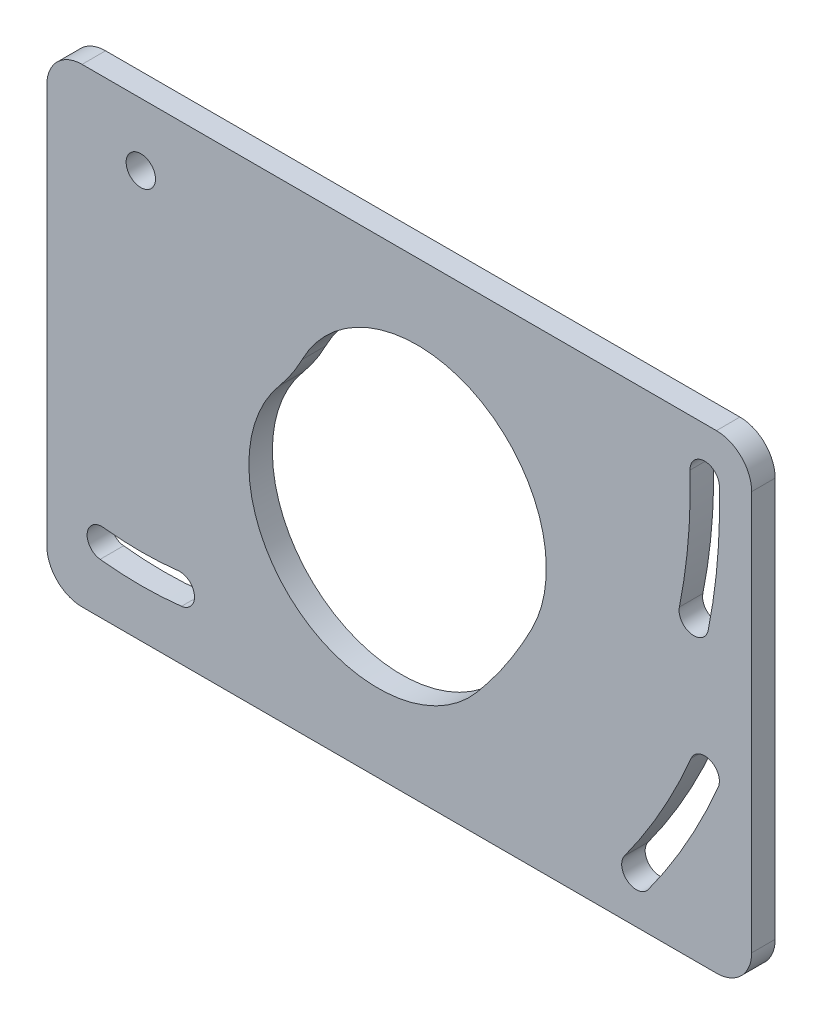
ISO-10303-21;
HEADER;
FILE_DESCRIPTION(('STEP AP214'),'2;1');
FILE_NAME('part.step','',(''),(''),'','','');
FILE_SCHEMA(('AUTOMOTIVE_DESIGN { 1 0 10303 214 1 1 1 1 }'));
ENDSEC;
DATA;
#1=APPLICATION_CONTEXT('core data for automotive mechanical design processes');
#2=APPLICATION_PROTOCOL_DEFINITION('international standard','automotive_design',2000,#1);
#3=PRODUCT_CONTEXT('',#1,'mechanical');
#4=PRODUCT('Part','Part','',(#3));
#5=PRODUCT_RELATED_PRODUCT_CATEGORY('part','',(#4));
#6=PRODUCT_DEFINITION_FORMATION('','',#4);
#7=PRODUCT_DEFINITION_CONTEXT('part definition',#1,'design');
#8=PRODUCT_DEFINITION('design','',#6,#7);
#9=PRODUCT_DEFINITION_SHAPE('','',#8);
#10=(LENGTH_UNIT() NAMED_UNIT(*) SI_UNIT(.MILLI.,.METRE.));
#11=(NAMED_UNIT(*) PLANE_ANGLE_UNIT() SI_UNIT($,.RADIAN.));
#12=(NAMED_UNIT(*) SI_UNIT($,.STERADIAN.) SOLID_ANGLE_UNIT());
#13=UNCERTAINTY_MEASURE_WITH_UNIT(LENGTH_MEASURE(1.E-05),#10,'distance_accuracy_value','');
#14=(GEOMETRIC_REPRESENTATION_CONTEXT(3) GLOBAL_UNCERTAINTY_ASSIGNED_CONTEXT((#13)) GLOBAL_UNIT_ASSIGNED_CONTEXT((#10,
#11,#12)) REPRESENTATION_CONTEXT('',''));
#15=CARTESIAN_POINT('',(0.,0.,0.));
#16=DIRECTION('',(0.,0.,1.));
#17=DIRECTION('',(1.,0.,0.));
#18=AXIS2_PLACEMENT_3D('',#15,#16,#17);
#19=CARTESIAN_POINT('',(-27.,17.,2.));
#20=DIRECTION('',(0.,0.,-1.));
#21=DIRECTION('',(-1.,0.,0.));
#22=AXIS2_PLACEMENT_3D('',#19,#20,#21);
#23=CYLINDRICAL_SURFACE('',#22,3.);
#24=CARTESIAN_POINT('',(-27.,17.,0.));
#25=DIRECTION('',(0.,0.,1.));
#26=DIRECTION('',(1.,0.,0.));
#27=AXIS2_PLACEMENT_3D('',#24,#25,#26);
#28=CIRCLE('',#27,3.);
#29=CARTESIAN_POINT('',(-30.,17.,0.));
#30=VERTEX_POINT('',#29);
#31=CARTESIAN_POINT('',(-27.,20.,0.));
#32=VERTEX_POINT('',#31);
#33=EDGE_CURVE('E284',#30,#32,#28,.F.);
#34=ORIENTED_EDGE('',*,*,#33,.F.);
#35=DIRECTION('',(0.,0.,-1.));
#36=VECTOR('',#35,1.);
#37=CARTESIAN_POINT('',(-30.,17.,2.));
#38=LINE('',#37,#36);
#39=CARTESIAN_POINT('',(-30.,17.,2.));
#40=VERTEX_POINT('',#39);
#41=EDGE_CURVE('E11',#40,#30,#38,.T.);
#42=ORIENTED_EDGE('',*,*,#41,.F.);
#43=CARTESIAN_POINT('',(-27.,17.,2.));
#44=DIRECTION('',(0.,0.,1.));
#45=DIRECTION('',(1.,0.,0.));
#46=AXIS2_PLACEMENT_3D('',#43,#44,#45);
#47=CIRCLE('',#46,3.);
#48=CARTESIAN_POINT('',(-27.,20.,2.));
#49=VERTEX_POINT('',#48);
#50=EDGE_CURVE('E402',#40,#49,#47,.F.);
#51=ORIENTED_EDGE('',*,*,#50,.T.);
#52=DIRECTION('',(0.,0.,-1.));
#53=VECTOR('',#52,1.);
#54=CARTESIAN_POINT('',(-27.,20.,2.));
#55=LINE('',#54,#53);
#56=EDGE_CURVE('E54',#49,#32,#55,.T.);
#57=ORIENTED_EDGE('',*,*,#56,.T.);
#58=EDGE_LOOP('',(#34,#42,#51,#57));
#59=FACE_BOUND('',#58,.T.);
#60=ADVANCED_FACE('F35',(#59),#23,.T.);
#61=CARTESIAN_POINT('',(-30.,0.,2.));
#62=DIRECTION('',(-1.,0.,0.));
#63=DIRECTION('',(0.,0.,1.));
#64=AXIS2_PLACEMENT_3D('',#61,#62,#63);
#65=PLANE('',#64);
#66=DIRECTION('',(0.,1.,0.));
#67=VECTOR('',#66,1.);
#68=CARTESIAN_POINT('',(-30.,0.,0.));
#69=LINE('',#68,#67);
#70=CARTESIAN_POINT('',(-30.,-17.,0.));
#71=VERTEX_POINT('',#70);
#72=EDGE_CURVE('E286',#71,#30,#69,.T.);
#73=ORIENTED_EDGE('',*,*,#72,.F.);
#74=DIRECTION('',(0.,0.,-1.));
#75=VECTOR('',#74,1.);
#76=CARTESIAN_POINT('',(-30.,-17.,2.));
#77=LINE('',#76,#75);
#78=CARTESIAN_POINT('',(-30.,-17.,2.));
#79=VERTEX_POINT('',#78);
#80=EDGE_CURVE('E45',#79,#71,#77,.T.);
#81=ORIENTED_EDGE('',*,*,#80,.F.);
#82=DIRECTION('',(0.,1.,0.));
#83=VECTOR('',#82,1.);
#84=CARTESIAN_POINT('',(-30.,0.,2.));
#85=LINE('',#84,#83);
#86=EDGE_CURVE('E404',#79,#40,#85,.T.);
#87=ORIENTED_EDGE('',*,*,#86,.T.);
#88=ORIENTED_EDGE('',*,*,#41,.T.);
#89=EDGE_LOOP('',(#73,#81,#87,#88));
#90=FACE_BOUND('',#89,.T.);
#91=ADVANCED_FACE('F435',(#90),#65,.T.);
#92=CARTESIAN_POINT('',(-27.,-17.,2.));
#93=DIRECTION('',(0.,0.,-1.));
#94=DIRECTION('',(-1.,0.,0.));
#95=AXIS2_PLACEMENT_3D('',#92,#93,#94);
#96=CYLINDRICAL_SURFACE('',#95,3.);
#97=CARTESIAN_POINT('',(-27.,-17.,0.));
#98=DIRECTION('',(0.,0.,1.));
#99=DIRECTION('',(1.,0.,0.));
#100=AXIS2_PLACEMENT_3D('',#97,#98,#99);
#101=CIRCLE('',#100,3.);
#102=CARTESIAN_POINT('',(-27.,-20.,0.));
#103=VERTEX_POINT('',#102);
#104=EDGE_CURVE('E289',#103,#71,#101,.F.);
#105=ORIENTED_EDGE('',*,*,#104,.F.);
#106=DIRECTION('',(0.,0.,-1.));
#107=VECTOR('',#106,1.);
#108=CARTESIAN_POINT('',(-27.,-20.,2.));
#109=LINE('',#108,#107);
#110=CARTESIAN_POINT('',(-27.,-20.,2.));
#111=VERTEX_POINT('',#110);
#112=EDGE_CURVE('E311',#111,#103,#109,.T.);
#113=ORIENTED_EDGE('',*,*,#112,.F.);
#114=CARTESIAN_POINT('',(-27.,-17.,2.));
#115=DIRECTION('',(0.,0.,1.));
#116=DIRECTION('',(1.,0.,0.));
#117=AXIS2_PLACEMENT_3D('',#114,#115,#116);
#118=CIRCLE('',#117,3.);
#119=EDGE_CURVE('E407',#111,#79,#118,.F.);
#120=ORIENTED_EDGE('',*,*,#119,.T.);
#121=ORIENTED_EDGE('',*,*,#80,.T.);
#122=EDGE_LOOP('',(#105,#113,#120,#121));
#123=FACE_BOUND('',#122,.T.);
#124=ADVANCED_FACE('F440',(#123),#96,.T.);
#125=CARTESIAN_POINT('',(0.,-20.,2.));
#126=DIRECTION('',(0.,1.,0.));
#127=DIRECTION('',(0.,0.,1.));
#128=AXIS2_PLACEMENT_3D('',#125,#126,#127);
#129=PLANE('',#128);
#130=DIRECTION('',(1.,0.,0.));
#131=VECTOR('',#130,1.);
#132=CARTESIAN_POINT('',(0.,-20.,0.));
#133=LINE('',#132,#131);
#134=CARTESIAN_POINT('',(27.,-20.,0.));
#135=VERTEX_POINT('',#134);
#136=EDGE_CURVE('E292',#103,#135,#133,.T.);
#137=ORIENTED_EDGE('',*,*,#136,.T.);
#138=DIRECTION('',(0.,0.,-1.));
#139=VECTOR('',#138,1.);
#140=CARTESIAN_POINT('',(27.,-20.,2.));
#141=LINE('',#140,#139);
#142=CARTESIAN_POINT('',(27.,-20.,2.));
#143=VERTEX_POINT('',#142);
#144=EDGE_CURVE('E308',#143,#135,#141,.T.);
#145=ORIENTED_EDGE('',*,*,#144,.F.);
#146=DIRECTION('',(1.,0.,0.));
#147=VECTOR('',#146,1.);
#148=CARTESIAN_POINT('',(0.,-20.,2.));
#149=LINE('',#148,#147);
#150=EDGE_CURVE('E410',#111,#143,#149,.T.);
#151=ORIENTED_EDGE('',*,*,#150,.F.);
#152=ORIENTED_EDGE('',*,*,#112,.T.);
#153=EDGE_LOOP('',(#137,#145,#151,#152));
#154=FACE_BOUND('',#153,.T.);
#155=ADVANCED_FACE('F416',(#154),#129,.F.);
#156=CARTESIAN_POINT('',(27.,-17.,2.));
#157=DIRECTION('',(0.,0.,-1.));
#158=DIRECTION('',(-1.,0.,0.));
#159=AXIS2_PLACEMENT_3D('',#156,#157,#158);
#160=CYLINDRICAL_SURFACE('',#159,3.);
#161=CARTESIAN_POINT('',(27.,-17.,0.));
#162=DIRECTION('',(0.,0.,1.));
#163=DIRECTION('',(1.,0.,0.));
#164=AXIS2_PLACEMENT_3D('',#161,#162,#163);
#165=CIRCLE('',#164,3.);
#166=CARTESIAN_POINT('',(30.,-17.,0.));
#167=VERTEX_POINT('',#166);
#168=EDGE_CURVE('E295',#135,#167,#165,.T.);
#169=ORIENTED_EDGE('',*,*,#168,.T.);
#170=DIRECTION('',(0.,0.,-1.));
#171=VECTOR('',#170,1.);
#172=CARTESIAN_POINT('',(30.,-17.,2.));
#173=LINE('',#172,#171);
#174=CARTESIAN_POINT('',(30.,-17.,2.));
#175=VERTEX_POINT('',#174);
#176=EDGE_CURVE('E224',#175,#167,#173,.T.);
#177=ORIENTED_EDGE('',*,*,#176,.F.);
#178=CARTESIAN_POINT('',(27.,-17.,2.));
#179=DIRECTION('',(0.,0.,1.));
#180=DIRECTION('',(1.,0.,0.));
#181=AXIS2_PLACEMENT_3D('',#178,#179,#180);
#182=CIRCLE('',#181,3.);
#183=EDGE_CURVE('E213',#143,#175,#182,.T.);
#184=ORIENTED_EDGE('',*,*,#183,.F.);
#185=ORIENTED_EDGE('',*,*,#144,.T.);
#186=EDGE_LOOP('',(#169,#177,#184,#185));
#187=FACE_BOUND('',#186,.T.);
#188=ADVANCED_FACE('F419',(#187),#160,.T.);
#189=CARTESIAN_POINT('',(30.,0.,2.));
#190=DIRECTION('',(-1.,0.,0.));
#191=DIRECTION('',(0.,0.,1.));
#192=AXIS2_PLACEMENT_3D('',#189,#190,#191);
#193=PLANE('',#192);
#194=DIRECTION('',(0.,1.,0.));
#195=VECTOR('',#194,1.);
#196=CARTESIAN_POINT('',(30.,0.,0.));
#197=LINE('',#196,#195);
#198=CARTESIAN_POINT('',(30.,17.,0.));
#199=VERTEX_POINT('',#198);
#200=EDGE_CURVE('E221',#167,#199,#197,.T.);
#201=ORIENTED_EDGE('',*,*,#200,.T.);
#202=DIRECTION('',(0.,0.,-1.));
#203=VECTOR('',#202,1.);
#204=CARTESIAN_POINT('',(30.,17.,2.));
#205=LINE('',#204,#203);
#206=CARTESIAN_POINT('',(30.,17.,2.));
#207=VERTEX_POINT('',#206);
#208=EDGE_CURVE('E219',#207,#199,#205,.T.);
#209=ORIENTED_EDGE('',*,*,#208,.F.);
#210=DIRECTION('',(0.,1.,0.));
#211=VECTOR('',#210,1.);
#212=CARTESIAN_POINT('',(30.,0.,2.));
#213=LINE('',#212,#211);
#214=EDGE_CURVE('E205',#175,#207,#213,.T.);
#215=ORIENTED_EDGE('',*,*,#214,.F.);
#216=ORIENTED_EDGE('',*,*,#176,.T.);
#217=EDGE_LOOP('',(#201,#209,#215,#216));
#218=FACE_BOUND('',#217,.T.);
#219=ADVANCED_FACE('F220',(#218),#193,.F.);
#220=CARTESIAN_POINT('',(27.,17.,2.));
#221=DIRECTION('',(0.,0.,-1.));
#222=DIRECTION('',(-1.,0.,0.));
#223=AXIS2_PLACEMENT_3D('',#220,#221,#222);
#224=CYLINDRICAL_SURFACE('',#223,3.);
#225=CARTESIAN_POINT('',(27.,17.,0.));
#226=DIRECTION('',(0.,0.,1.));
#227=DIRECTION('',(1.,0.,0.));
#228=AXIS2_PLACEMENT_3D('',#225,#226,#227);
#229=CIRCLE('',#228,3.);
#230=CARTESIAN_POINT('',(27.,20.,0.));
#231=VERTEX_POINT('',#230);
#232=EDGE_CURVE('E299',#231,#199,#229,.F.);
#233=ORIENTED_EDGE('',*,*,#232,.F.);
#234=DIRECTION('',(0.,0.,-1.));
#235=VECTOR('',#234,1.);
#236=CARTESIAN_POINT('',(27.,20.,2.));
#237=LINE('',#236,#235);
#238=CARTESIAN_POINT('',(27.,20.,2.));
#239=VERTEX_POINT('',#238);
#240=EDGE_CURVE('E127',#239,#231,#237,.T.);
#241=ORIENTED_EDGE('',*,*,#240,.F.);
#242=CARTESIAN_POINT('',(27.,17.,2.));
#243=DIRECTION('',(0.,0.,1.));
#244=DIRECTION('',(1.,0.,0.));
#245=AXIS2_PLACEMENT_3D('',#242,#243,#244);
#246=CIRCLE('',#245,3.);
#247=EDGE_CURVE('E211',#239,#207,#246,.F.);
#248=ORIENTED_EDGE('',*,*,#247,.T.);
#249=ORIENTED_EDGE('',*,*,#208,.T.);
#250=EDGE_LOOP('',(#233,#241,#248,#249));
#251=FACE_BOUND('',#250,.T.);
#252=ADVANCED_FACE('F226',(#251),#224,.T.);
#253=CARTESIAN_POINT('',(-18.6793723961413,-14.4781077665131,2.));
#254=DIRECTION('',(0.,0.,-1.));
#255=DIRECTION('',(-1.,0.,0.));
#256=AXIS2_PLACEMENT_3D('',#253,#254,#255);
#257=CYLINDRICAL_SURFACE('',#256,1.25);
#258=CARTESIAN_POINT('',(-18.6793723961413,-14.4781077665131,0.));
#259=DIRECTION('',(0.,0.,1.));
#260=DIRECTION('',(1.,0.,0.));
#261=AXIS2_PLACEMENT_3D('',#258,#259,#260);
#262=CIRCLE('',#261,1.25);
#263=CARTESIAN_POINT('',(-18.5378683789314,-15.7200725861088,0.));
#264=VERTEX_POINT('',#263);
#265=CARTESIAN_POINT('',(-18.8208764133512,-13.2361429469173,0.));
#266=VERTEX_POINT('',#265);
#267=EDGE_CURVE('E269',#264,#266,#262,.T.);
#268=ORIENTED_EDGE('',*,*,#267,.F.);
#269=DIRECTION('',(0.,0.,-1.));
#270=VECTOR('',#269,1.);
#271=CARTESIAN_POINT('',(-18.5378683789314,-15.7200725861088,2.));
#272=LINE('',#271,#270);
#273=CARTESIAN_POINT('',(-18.5378683789314,-15.7200725861088,2.));
#274=VERTEX_POINT('',#273);
#275=EDGE_CURVE('E305',#274,#264,#272,.T.);
#276=ORIENTED_EDGE('',*,*,#275,.F.);
#277=CARTESIAN_POINT('',(-18.6793723961413,-14.4781077665131,2.));
#278=DIRECTION('',(0.,0.,1.));
#279=DIRECTION('',(1.,0.,0.));
#280=AXIS2_PLACEMENT_3D('',#277,#278,#279);
#281=CIRCLE('',#280,1.25);
#282=CARTESIAN_POINT('',(-18.8208764133512,-13.2361429469173,2.));
#283=VERTEX_POINT('',#282);
#284=EDGE_CURVE('E388',#274,#283,#281,.T.);
#285=ORIENTED_EDGE('',*,*,#284,.T.);
#286=DIRECTION('',(0.,0.,-1.));
#287=VECTOR('',#286,1.);
#288=CARTESIAN_POINT('',(-18.8208764133512,-13.2361429469173,2.));
#289=LINE('',#288,#287);
#290=EDGE_CURVE('E314',#283,#266,#289,.T.);
#291=ORIENTED_EDGE('',*,*,#290,.T.);
#292=EDGE_LOOP('',(#268,#276,#285,#291));
#293=FACE_BOUND('',#292,.T.);
#294=ADVANCED_FACE('F462',(#293),#257,.F.);
#295=CARTESIAN_POINT('',(-22.,14.6666666666667,2.));
#296=DIRECTION('',(0.,0.,-1.));
#297=DIRECTION('',(-1.,0.,0.));
#298=AXIS2_PLACEMENT_3D('',#295,#296,#297);
#299=CYLINDRICAL_SURFACE('',#298,30.5833333333332);
#300=CARTESIAN_POINT('',(-22.,14.6666666666667,0.));
#301=DIRECTION('',(0.,0.,1.));
#302=DIRECTION('',(1.,0.,0.));
#303=AXIS2_PLACEMENT_3D('',#300,#301,#302);
#304=CIRCLE('',#303,30.5833333333332);
#305=CARTESIAN_POINT('',(-25.4621316210681,-15.7200725861089,0.));
#306=VERTEX_POINT('',#305);
#307=EDGE_CURVE('E272',#306,#264,#304,.T.);
#308=ORIENTED_EDGE('',*,*,#307,.F.);
#309=DIRECTION('',(0.,0.,-1.));
#310=VECTOR('',#309,1.);
#311=CARTESIAN_POINT('',(-25.4621316210681,-15.7200725861089,2.));
#312=LINE('',#311,#310);
#313=CARTESIAN_POINT('',(-25.4621316210681,-15.7200725861089,2.));
#314=VERTEX_POINT('',#313);
#315=EDGE_CURVE('E319',#314,#306,#312,.T.);
#316=ORIENTED_EDGE('',*,*,#315,.F.);
#317=CARTESIAN_POINT('',(-22.,14.6666666666667,2.));
#318=DIRECTION('',(0.,0.,1.));
#319=DIRECTION('',(1.,0.,0.));
#320=AXIS2_PLACEMENT_3D('',#317,#318,#319);
#321=CIRCLE('',#320,30.5833333333332);
#322=EDGE_CURVE('E391',#314,#274,#321,.T.);
#323=ORIENTED_EDGE('',*,*,#322,.T.);
#324=ORIENTED_EDGE('',*,*,#275,.T.);
#325=EDGE_LOOP('',(#308,#316,#323,#324));
#326=FACE_BOUND('',#325,.T.);
#327=ADVANCED_FACE('F458',(#326),#299,.F.);
#328=CARTESIAN_POINT('',(-25.3206276038583,-14.4781077665131,2.));
#329=DIRECTION('',(0.,0.,-1.));
#330=DIRECTION('',(-1.,0.,0.));
#331=AXIS2_PLACEMENT_3D('',#328,#329,#330);
#332=CYLINDRICAL_SURFACE('',#331,1.25);
#333=CARTESIAN_POINT('',(-25.3206276038583,-14.4781077665131,0.));
#334=DIRECTION('',(0.,0.,1.));
#335=DIRECTION('',(1.,0.,0.));
#336=AXIS2_PLACEMENT_3D('',#333,#334,#335);
#337=CIRCLE('',#336,1.25);
#338=CARTESIAN_POINT('',(-25.1791235866484,-13.2361429469174,0.));
#339=VERTEX_POINT('',#338);
#340=EDGE_CURVE('E275',#339,#306,#337,.T.);
#341=ORIENTED_EDGE('',*,*,#340,.F.);
#342=DIRECTION('',(0.,0.,-1.));
#343=VECTOR('',#342,1.);
#344=CARTESIAN_POINT('',(-25.1791235866484,-13.2361429469174,2.));
#345=LINE('',#344,#343);
#346=CARTESIAN_POINT('',(-25.1791235866484,-13.2361429469174,2.));
#347=VERTEX_POINT('',#346);
#348=EDGE_CURVE('E316',#347,#339,#345,.T.);
#349=ORIENTED_EDGE('',*,*,#348,.F.);
#350=CARTESIAN_POINT('',(-25.3206276038583,-14.4781077665131,2.));
#351=DIRECTION('',(0.,0.,1.));
#352=DIRECTION('',(1.,0.,0.));
#353=AXIS2_PLACEMENT_3D('',#350,#351,#352);
#354=CIRCLE('',#353,1.25);
#355=EDGE_CURVE('E394',#347,#314,#354,.T.);
#356=ORIENTED_EDGE('',*,*,#355,.T.);
#357=ORIENTED_EDGE('',*,*,#315,.T.);
#358=EDGE_LOOP('',(#341,#349,#356,#357));
#359=FACE_BOUND('',#358,.T.);
#360=ADVANCED_FACE('F454',(#359),#332,.F.);
#361=CARTESIAN_POINT('',(26.,-5.72498613163695,2.));
#362=DIRECTION('',(0.,0.,-1.));
#363=DIRECTION('',(-1.,0.,0.));
#364=AXIS2_PLACEMENT_3D('',#361,#362,#363);
#365=CYLINDRICAL_SURFACE('',#364,1.25);
#366=CARTESIAN_POINT('',(26.,-5.72498613163695,0.));
#367=DIRECTION('',(0.,0.,1.));
#368=DIRECTION('',(1.,0.,0.));
#369=AXIS2_PLACEMENT_3D('',#366,#367,#368);
#370=CIRCLE('',#369,1.25);
#371=CARTESIAN_POINT('',(27.1504856563741,-6.21374246609965,0.));
#372=VERTEX_POINT('',#371);
#373=CARTESIAN_POINT('',(24.8495143436259,-5.23622979717426,0.));
#374=VERTEX_POINT('',#373);
#375=EDGE_CURVE('E257',#372,#374,#370,.T.);
#376=ORIENTED_EDGE('',*,*,#375,.F.);
#377=DIRECTION('',(0.,0.,-1.));
#378=VECTOR('',#377,1.);
#379=CARTESIAN_POINT('',(27.1504856563741,-6.21374246609965,2.));
#380=LINE('',#379,#378);
#381=CARTESIAN_POINT('',(27.1504856563741,-6.21374246609965,2.));
#382=VERTEX_POINT('',#381);
#383=EDGE_CURVE('E317',#382,#372,#380,.T.);
#384=ORIENTED_EDGE('',*,*,#383,.F.);
#385=CARTESIAN_POINT('',(26.,-5.72498613163695,2.));
#386=DIRECTION('',(0.,0.,1.));
#387=DIRECTION('',(1.,0.,0.));
#388=AXIS2_PLACEMENT_3D('',#385,#386,#387);
#389=CIRCLE('',#388,1.25);
#390=CARTESIAN_POINT('',(24.8495143436259,-5.23622979717426,2.));
#391=VERTEX_POINT('',#390);
#392=EDGE_CURVE('E377',#382,#391,#389,.T.);
#393=ORIENTED_EDGE('',*,*,#392,.T.);
#394=DIRECTION('',(0.,0.,-1.));
#395=VECTOR('',#394,1.);
#396=CARTESIAN_POINT('',(24.8495143436259,-5.23622979717426,2.));
#397=LINE('',#396,#395);
#398=EDGE_CURVE('E322',#391,#374,#397,.T.);
#399=ORIENTED_EDGE('',*,*,#398,.T.);
#400=EDGE_LOOP('',(#376,#384,#393,#399));
#401=FACE_BOUND('',#400,.T.);
#402=ADVANCED_FACE('F457',(#401),#365,.F.);
#403=CARTESIAN_POINT('',(-22.,14.6666666666667,2.));
#404=DIRECTION('',(0.,0.,-1.));
#405=DIRECTION('',(-1.,0.,0.));
#406=AXIS2_PLACEMENT_3D('',#403,#404,#405);
#407=CYLINDRICAL_SURFACE('',#406,53.4018887850341);
#408=CARTESIAN_POINT('',(-22.,14.6666666666667,0.));
#409=DIRECTION('',(0.,0.,1.));
#410=DIRECTION('',(1.,0.,0.));
#411=AXIS2_PLACEMENT_3D('',#408,#409,#410);
#412=CIRCLE('',#411,53.4018887850341);
#413=CARTESIAN_POINT('',(21.1936918436799,-16.7350325026835,0.));
#414=VERTEX_POINT('',#413);
#415=EDGE_CURVE('E260',#414,#372,#412,.T.);
#416=ORIENTED_EDGE('',*,*,#415,.F.);
#417=DIRECTION('',(0.,0.,-1.));
#418=VECTOR('',#417,1.);
#419=CARTESIAN_POINT('',(21.1936918436799,-16.7350325026835,2.));
#420=LINE('',#419,#418);
#421=CARTESIAN_POINT('',(21.1936918436799,-16.7350325026835,2.));
#422=VERTEX_POINT('',#421);
#423=EDGE_CURVE('E327',#422,#414,#420,.T.);
#424=ORIENTED_EDGE('',*,*,#423,.F.);
#425=CARTESIAN_POINT('',(-22.,14.6666666666667,2.));
#426=DIRECTION('',(0.,0.,1.));
#427=DIRECTION('',(1.,0.,0.));
#428=AXIS2_PLACEMENT_3D('',#425,#426,#427);
#429=CIRCLE('',#428,53.4018887850341);
#430=EDGE_CURVE('E380',#422,#382,#429,.T.);
#431=ORIENTED_EDGE('',*,*,#430,.T.);
#432=ORIENTED_EDGE('',*,*,#383,.T.);
#433=EDGE_LOOP('',(#416,#424,#431,#432));
#434=FACE_BOUND('',#433,.T.);
#435=ADVANCED_FACE('F474',(#434),#407,.F.);
#436=CARTESIAN_POINT('',(20.1826393128988,-16.,2.));
#437=DIRECTION('',(0.,0.,-1.));
#438=DIRECTION('',(-1.,0.,0.));
#439=AXIS2_PLACEMENT_3D('',#436,#437,#438);
#440=CYLINDRICAL_SURFACE('',#439,1.25);
#441=CARTESIAN_POINT('',(20.1826393128988,-16.,0.));
#442=DIRECTION('',(0.,0.,1.));
#443=DIRECTION('',(1.,0.,0.));
#444=AXIS2_PLACEMENT_3D('',#441,#442,#443);
#445=CIRCLE('',#444,1.25);
#446=CARTESIAN_POINT('',(19.1715867821177,-15.2649674973166,0.));
#447=VERTEX_POINT('',#446);
#448=EDGE_CURVE('E263',#447,#414,#445,.T.);
#449=ORIENTED_EDGE('',*,*,#448,.F.);
#450=DIRECTION('',(0.,0.,-1.));
#451=VECTOR('',#450,1.);
#452=CARTESIAN_POINT('',(19.1715867821177,-15.2649674973166,2.));
#453=LINE('',#452,#451);
#454=CARTESIAN_POINT('',(19.1715867821177,-15.2649674973166,2.));
#455=VERTEX_POINT('',#454);
#456=EDGE_CURVE('E324',#455,#447,#453,.T.);
#457=ORIENTED_EDGE('',*,*,#456,.F.);
#458=CARTESIAN_POINT('',(20.1826393128988,-16.,2.));
#459=DIRECTION('',(0.,0.,1.));
#460=DIRECTION('',(1.,0.,0.));
#461=AXIS2_PLACEMENT_3D('',#458,#459,#460);
#462=CIRCLE('',#461,1.25);
#463=EDGE_CURVE('E383',#455,#422,#462,.T.);
#464=ORIENTED_EDGE('',*,*,#463,.T.);
#465=ORIENTED_EDGE('',*,*,#423,.T.);
#466=EDGE_LOOP('',(#449,#457,#464,#465));
#467=FACE_BOUND('',#466,.T.);
#468=ADVANCED_FACE('F470',(#467),#440,.F.);
#469=CARTESIAN_POINT('',(1.51889462681423,2.58475015297068,2.));
#470=DIRECTION('',(0.,0.,-1.));
#471=DIRECTION('',(-1.,0.,0.));
#472=AXIS2_PLACEMENT_3D('',#469,#470,#471);
#473=CYLINDRICAL_SURFACE('',#472,11.);
#474=CARTESIAN_POINT('',(1.51889462681423,2.58475015297068,0.));
#475=DIRECTION('',(0.,0.,1.));
#476=DIRECTION('',(1.,0.,0.));
#477=AXIS2_PLACEMENT_3D('',#474,#475,#476);
#478=CIRCLE('',#477,11.);
#479=CARTESIAN_POINT('',(11.303346225185,-2.44163094272233,0.));
#480=VERTEX_POINT('',#479);
#481=CARTESIAN_POINT('',(-8.26555697155653,7.61113124866368,0.));
#482=VERTEX_POINT('',#481);
#483=EDGE_CURVE('E245',#480,#482,#478,.T.);
#484=ORIENTED_EDGE('',*,*,#483,.F.);
#485=DIRECTION('',(0.,0.,-1.));
#486=VECTOR('',#485,1.);
#487=CARTESIAN_POINT('',(11.303346225185,-2.44163094272233,2.));
#488=LINE('',#487,#486);
#489=CARTESIAN_POINT('',(11.303346225185,-2.44163094272233,2.));
#490=VERTEX_POINT('',#489);
#491=EDGE_CURVE('E325',#490,#480,#488,.T.);
#492=ORIENTED_EDGE('',*,*,#491,.F.);
#493=CARTESIAN_POINT('',(1.51889462681423,2.58475015297068,2.));
#494=DIRECTION('',(0.,0.,1.));
#495=DIRECTION('',(1.,0.,0.));
#496=AXIS2_PLACEMENT_3D('',#493,#494,#495);
#497=CIRCLE('',#496,11.);
#498=CARTESIAN_POINT('',(-8.26555697155653,7.61113124866368,2.));
#499=VERTEX_POINT('',#498);
#500=EDGE_CURVE('E363',#490,#499,#497,.T.);
#501=ORIENTED_EDGE('',*,*,#500,.T.);
#502=DIRECTION('',(0.,0.,-1.));
#503=VECTOR('',#502,1.);
#504=CARTESIAN_POINT('',(-8.26555697155653,7.61113124866368,2.));
#505=LINE('',#504,#503);
#506=EDGE_CURVE('E330',#499,#482,#505,.T.);
#507=ORIENTED_EDGE('',*,*,#506,.T.);
#508=EDGE_LOOP('',(#484,#492,#501,#507));
#509=FACE_BOUND('',#508,.T.);
#510=ADVANCED_FACE('F473',(#509),#473,.F.);
#511=CARTESIAN_POINT('',(-22.,14.6666666666667,2.));
#512=DIRECTION('',(0.,0.,-1.));
#513=DIRECTION('',(-1.,0.,0.));
#514=AXIS2_PLACEMENT_3D('',#511,#512,#513);
#515=CYLINDRICAL_SURFACE('',#514,37.4407093534026);
#516=CARTESIAN_POINT('',(-22.,14.6666666666667,0.));
#517=DIRECTION('',(0.,0.,1.));
#518=DIRECTION('',(1.,0.,0.));
#519=AXIS2_PLACEMENT_3D('',#516,#517,#518);
#520=CIRCLE('',#519,37.4407093534026);
#521=CARTESIAN_POINT('',(6.60125403373791,-9.49476922989294,0.));
#522=VERTEX_POINT('',#521);
#523=EDGE_CURVE('E248',#522,#480,#520,.T.);
#524=ORIENTED_EDGE('',*,*,#523,.F.);
#525=DIRECTION('',(0.,0.,-1.));
#526=VECTOR('',#525,1.);
#527=CARTESIAN_POINT('',(6.60125403373791,-9.49476922989294,2.));
#528=LINE('',#527,#526);
#529=CARTESIAN_POINT('',(6.60125403373791,-9.49476922989294,2.));
#530=VERTEX_POINT('',#529);
#531=EDGE_CURVE('E334',#530,#522,#528,.T.);
#532=ORIENTED_EDGE('',*,*,#531,.F.);
#533=CARTESIAN_POINT('',(-22.,14.6666666666667,2.));
#534=DIRECTION('',(0.,0.,1.));
#535=DIRECTION('',(1.,0.,0.));
#536=AXIS2_PLACEMENT_3D('',#533,#534,#535);
#537=CIRCLE('',#536,37.4407093534026);
#538=EDGE_CURVE('E366',#530,#490,#537,.T.);
#539=ORIENTED_EDGE('',*,*,#538,.T.);
#540=ORIENTED_EDGE('',*,*,#491,.T.);
#541=EDGE_LOOP('',(#524,#532,#539,#540));
#542=FACE_BOUND('',#541,.T.);
#543=ADVANCED_FACE('F488',(#542),#515,.F.);
#544=CARTESIAN_POINT('',(-1.80173297704438,-2.39619125281724,2.));
#545=DIRECTION('',(0.,0.,-1.));
#546=DIRECTION('',(-1.,0.,0.));
#547=AXIS2_PLACEMENT_3D('',#544,#545,#546);
#548=CYLINDRICAL_SURFACE('',#547,11.);
#549=CARTESIAN_POINT('',(-1.80173297704438,-2.39619125281724,0.));
#550=DIRECTION('',(0.,0.,1.));
#551=DIRECTION('',(1.,0.,0.));
#552=AXIS2_PLACEMENT_3D('',#549,#550,#551);
#553=CIRCLE('',#552,11.);
#554=CARTESIAN_POINT('',(-10.2047199878267,4.70238672425845,0.));
#555=VERTEX_POINT('',#554);
#556=EDGE_CURVE('E251',#555,#522,#553,.T.);
#557=ORIENTED_EDGE('',*,*,#556,.F.);
#558=DIRECTION('',(0.,0.,-1.));
#559=VECTOR('',#558,1.);
#560=CARTESIAN_POINT('',(-10.2047199878267,4.70238672425845,2.));
#561=LINE('',#560,#559);
#562=CARTESIAN_POINT('',(-10.2047199878267,4.70238672425845,2.));
#563=VERTEX_POINT('',#562);
#564=EDGE_CURVE('E332',#563,#555,#561,.T.);
#565=ORIENTED_EDGE('',*,*,#564,.F.);
#566=CARTESIAN_POINT('',(-1.80173297704438,-2.39619125281724,2.));
#567=DIRECTION('',(0.,0.,1.));
#568=DIRECTION('',(1.,0.,0.));
#569=AXIS2_PLACEMENT_3D('',#566,#567,#568);
#570=CIRCLE('',#569,11.);
#571=EDGE_CURVE('E372',#563,#530,#570,.T.);
#572=ORIENTED_EDGE('',*,*,#571,.T.);
#573=ORIENTED_EDGE('',*,*,#531,.T.);
#574=EDGE_LOOP('',(#557,#565,#572,#573));
#575=FACE_BOUND('',#574,.T.);
#576=ADVANCED_FACE('F485',(#575),#548,.F.);
#577=CARTESIAN_POINT('',(-22.,14.6666666666667,2.));
#578=DIRECTION('',(0.,0.,-1.));
#579=DIRECTION('',(-1.,0.,0.));
#580=AXIS2_PLACEMENT_3D('',#577,#578,#579);
#581=CYLINDRICAL_SURFACE('',#580,46.768514947651);
#582=CARTESIAN_POINT('',(-22.,14.6666666666667,0.));
#583=DIRECTION('',(0.,0.,1.));
#584=DIRECTION('',(1.,0.,0.));
#585=AXIS2_PLACEMENT_3D('',#582,#583,#584);
#586=CIRCLE('',#585,46.768514947651);
#587=CARTESIAN_POINT('',(23.8443971002373,5.41543729298837,0.));
#588=VERTEX_POINT('',#587);
#589=CARTESIAN_POINT('',(24.7504819741841,15.9652911659496,0.));
#590=VERTEX_POINT('',#589);
#591=EDGE_CURVE('E233',#588,#590,#586,.T.);
#592=ORIENTED_EDGE('',*,*,#591,.T.);
#593=DIRECTION('',(0.,0.,-1.));
#594=VECTOR('',#593,1.);
#595=CARTESIAN_POINT('',(24.7504819741841,15.9652911659496,2.));
#596=LINE('',#595,#594);
#597=CARTESIAN_POINT('',(24.7504819741841,15.9652911659496,2.));
#598=VERTEX_POINT('',#597);
#599=EDGE_CURVE('E39',#598,#590,#596,.T.);
#600=ORIENTED_EDGE('',*,*,#599,.F.);
#601=CARTESIAN_POINT('',(-22.,14.6666666666667,2.));
#602=DIRECTION('',(0.,0.,1.));
#603=DIRECTION('',(1.,0.,0.));
#604=AXIS2_PLACEMENT_3D('',#601,#602,#603);
#605=CIRCLE('',#604,46.768514947651);
#606=CARTESIAN_POINT('',(23.8443971002373,5.41543729298837,2.));
#607=VERTEX_POINT('',#606);
#608=EDGE_CURVE('E140',#607,#598,#605,.T.);
#609=ORIENTED_EDGE('',*,*,#608,.F.);
#610=DIRECTION('',(0.,0.,-1.));
#611=VECTOR('',#610,1.);
#612=CARTESIAN_POINT('',(23.8443971002373,5.41543729298837,2.));
#613=LINE('',#612,#611);
#614=EDGE_CURVE('E229',#607,#588,#613,.T.);
#615=ORIENTED_EDGE('',*,*,#614,.T.);
#616=EDGE_LOOP('',(#592,#600,#609,#615));
#617=FACE_BOUND('',#616,.T.);
#618=ADVANCED_FACE('F37',(#617),#581,.T.);
#619=CARTESIAN_POINT('',(26.,16.,2.));
#620=DIRECTION('',(0.,0.,-1.));
#621=DIRECTION('',(-1.,0.,0.));
#622=AXIS2_PLACEMENT_3D('',#619,#620,#621);
#623=CYLINDRICAL_SURFACE('',#622,1.25000000000001);
#624=CARTESIAN_POINT('',(26.,16.,0.));
#625=DIRECTION('',(0.,0.,1.));
#626=DIRECTION('',(1.,0.,0.));
#627=AXIS2_PLACEMENT_3D('',#624,#625,#626);
#628=CIRCLE('',#627,1.25000000000001);
#629=CARTESIAN_POINT('',(27.2495180258159,16.0347088340504,0.));
#630=VERTEX_POINT('',#629);
#631=EDGE_CURVE('E236',#630,#590,#628,.T.);
#632=ORIENTED_EDGE('',*,*,#631,.F.);
#633=DIRECTION('',(0.,0.,-1.));
#634=VECTOR('',#633,1.);
#635=CARTESIAN_POINT('',(27.2495180258159,16.0347088340504,2.));
#636=LINE('',#635,#634);
#637=CARTESIAN_POINT('',(27.2495180258159,16.0347088340504,2.));
#638=VERTEX_POINT('',#637);
#639=EDGE_CURVE('E339',#638,#630,#636,.T.);
#640=ORIENTED_EDGE('',*,*,#639,.F.);
#641=CARTESIAN_POINT('',(26.,16.,2.));
#642=DIRECTION('',(0.,0.,1.));
#643=DIRECTION('',(1.,0.,0.));
#644=AXIS2_PLACEMENT_3D('',#641,#642,#643);
#645=CIRCLE('',#644,1.25000000000001);
#646=EDGE_CURVE('E347',#638,#598,#645,.T.);
#647=ORIENTED_EDGE('',*,*,#646,.T.);
#648=ORIENTED_EDGE('',*,*,#599,.T.);
#649=EDGE_LOOP('',(#632,#640,#647,#648));
#650=FACE_BOUND('',#649,.T.);
#651=ADVANCED_FACE('F346',(#650),#623,.F.);
#652=CARTESIAN_POINT('',(-22.,14.6666666666667,2.));
#653=DIRECTION('',(0.,0.,-1.));
#654=DIRECTION('',(-1.,0.,0.));
#655=AXIS2_PLACEMENT_3D('',#652,#653,#654);
#656=CYLINDRICAL_SURFACE('',#655,49.268514947651);
#657=CARTESIAN_POINT('',(-22.,14.6666666666667,0.));
#658=DIRECTION('',(0.,0.,1.));
#659=DIRECTION('',(1.,0.,0.));
#660=AXIS2_PLACEMENT_3D('',#657,#658,#659);
#661=CIRCLE('',#660,49.268514947651);
#662=CARTESIAN_POINT('',(26.2949985973958,4.92091499609518,0.));
#663=VERTEX_POINT('',#662);
#664=EDGE_CURVE('E239',#663,#630,#661,.T.);
#665=ORIENTED_EDGE('',*,*,#664,.F.);
#666=DIRECTION('',(0.,0.,-1.));
#667=VECTOR('',#666,1.);
#668=CARTESIAN_POINT('',(26.2949985973958,4.92091499609518,2.));
#669=LINE('',#668,#667);
#670=CARTESIAN_POINT('',(26.2949985973958,4.92091499609518,2.));
#671=VERTEX_POINT('',#670);
#672=EDGE_CURVE('E338',#671,#663,#669,.T.);
#673=ORIENTED_EDGE('',*,*,#672,.F.);
#674=CARTESIAN_POINT('',(-22.,14.6666666666667,2.));
#675=DIRECTION('',(0.,0.,1.));
#676=DIRECTION('',(1.,0.,0.));
#677=AXIS2_PLACEMENT_3D('',#674,#675,#676);
#678=CIRCLE('',#677,49.268514947651);
#679=EDGE_CURVE('E356',#671,#638,#678,.T.);
#680=ORIENTED_EDGE('',*,*,#679,.T.);
#681=ORIENTED_EDGE('',*,*,#639,.T.);
#682=EDGE_LOOP('',(#665,#673,#680,#681));
#683=FACE_BOUND('',#682,.T.);
#684=ADVANCED_FACE('F354',(#683),#656,.F.);
#685=CARTESIAN_POINT('',(-22.,14.6666666666667,2.));
#686=DIRECTION('',(0.,0.,-1.));
#687=DIRECTION('',(-1.,0.,0.));
#688=AXIS2_PLACEMENT_3D('',#685,#686,#687);
#689=CYLINDRICAL_SURFACE('',#688,1.25);
#690=CARTESIAN_POINT('',(-22.,14.6666666666667,2.));
#691=DIRECTION('',(0.,0.,1.));
#692=DIRECTION('',(1.,0.,0.));
#693=AXIS2_PLACEMENT_3D('',#690,#691,#692);
#694=CIRCLE('',#693,1.25);
#695=CARTESIAN_POINT('',(-20.75,14.6666666666667,2.));
#696=VERTEX_POINT('',#695);
#697=EDGE_CURVE('E399',#696,#696,#694,.T.);
#698=ORIENTED_EDGE('',*,*,#697,.T.);
#699=EDGE_LOOP('',(#698));
#700=FACE_BOUND('',#699,.T.);
#701=CARTESIAN_POINT('',(-22.,14.6666666666667,0.));
#702=DIRECTION('',(0.,0.,1.));
#703=DIRECTION('',(1.,0.,0.));
#704=AXIS2_PLACEMENT_3D('',#701,#702,#703);
#705=CIRCLE('',#704,1.25);
#706=CARTESIAN_POINT('',(-20.75,14.6666666666667,0.));
#707=VERTEX_POINT('',#706);
#708=EDGE_CURVE('E281',#707,#707,#705,.T.);
#709=ORIENTED_EDGE('',*,*,#708,.F.);
#710=EDGE_LOOP('',(#709));
#711=FACE_BOUND('',#710,.T.);
#712=ADVANCED_FACE('F445',(#700,#711),#689,.F.);
#713=CARTESIAN_POINT('',(-22.,14.6666666666667,2.));
#714=DIRECTION('',(0.,0.,-1.));
#715=DIRECTION('',(-1.,0.,0.));
#716=AXIS2_PLACEMENT_3D('',#713,#714,#715);
#717=CYLINDRICAL_SURFACE('',#716,28.0833333333332);
#718=CARTESIAN_POINT('',(-22.,14.6666666666667,0.));
#719=DIRECTION('',(0.,0.,1.));
#720=DIRECTION('',(1.,0.,0.));
#721=AXIS2_PLACEMENT_3D('',#718,#719,#720);
#722=CIRCLE('',#721,28.0833333333332);
#723=EDGE_CURVE('E278',#339,#266,#722,.T.);
#724=ORIENTED_EDGE('',*,*,#723,.T.);
#725=ORIENTED_EDGE('',*,*,#290,.F.);
#726=CARTESIAN_POINT('',(-22.,14.6666666666667,2.));
#727=DIRECTION('',(0.,0.,1.));
#728=DIRECTION('',(1.,0.,0.));
#729=AXIS2_PLACEMENT_3D('',#726,#727,#728);
#730=CIRCLE('',#729,28.0833333333332);
#731=EDGE_CURVE('E397',#347,#283,#730,.T.);
#732=ORIENTED_EDGE('',*,*,#731,.F.);
#733=ORIENTED_EDGE('',*,*,#348,.T.);
#734=EDGE_LOOP('',(#724,#725,#732,#733));
#735=FACE_BOUND('',#734,.T.);
#736=ADVANCED_FACE('F448',(#735),#717,.T.);
#737=CARTESIAN_POINT('',(-22.,14.6666666666667,2.));
#738=DIRECTION('',(0.,0.,-1.));
#739=DIRECTION('',(-1.,0.,0.));
#740=AXIS2_PLACEMENT_3D('',#737,#738,#739);
#741=CYLINDRICAL_SURFACE('',#740,50.9018887850341);
#742=CARTESIAN_POINT('',(-22.,14.6666666666667,0.));
#743=DIRECTION('',(0.,0.,1.));
#744=DIRECTION('',(1.,0.,0.));
#745=AXIS2_PLACEMENT_3D('',#742,#743,#744);
#746=CIRCLE('',#745,50.9018887850341);
#747=EDGE_CURVE('E266',#447,#374,#746,.T.);
#748=ORIENTED_EDGE('',*,*,#747,.T.);
#749=ORIENTED_EDGE('',*,*,#398,.F.);
#750=CARTESIAN_POINT('',(-22.,14.6666666666667,2.));
#751=DIRECTION('',(0.,0.,1.));
#752=DIRECTION('',(1.,0.,0.));
#753=AXIS2_PLACEMENT_3D('',#750,#751,#752);
#754=CIRCLE('',#753,50.9018887850341);
#755=EDGE_CURVE('E386',#455,#391,#754,.T.);
#756=ORIENTED_EDGE('',*,*,#755,.F.);
#757=ORIENTED_EDGE('',*,*,#456,.T.);
#758=EDGE_LOOP('',(#748,#749,#756,#757));
#759=FACE_BOUND('',#758,.T.);
#760=ADVANCED_FACE('F452',(#759),#741,.T.);
#761=CARTESIAN_POINT('',(-22.,14.6666666666667,2.));
#762=DIRECTION('',(0.,0.,-1.));
#763=DIRECTION('',(-1.,0.,0.));
#764=AXIS2_PLACEMENT_3D('',#761,#762,#763);
#765=CYLINDRICAL_SURFACE('',#764,15.4407093534026);
#766=CARTESIAN_POINT('',(-22.,14.6666666666667,0.));
#767=DIRECTION('',(0.,0.,1.));
#768=DIRECTION('',(1.,0.,0.));
#769=AXIS2_PLACEMENT_3D('',#766,#767,#768);
#770=CIRCLE('',#769,15.4407093534026);
#771=EDGE_CURVE('E254',#555,#482,#770,.T.);
#772=ORIENTED_EDGE('',*,*,#771,.T.);
#773=ORIENTED_EDGE('',*,*,#506,.F.);
#774=CARTESIAN_POINT('',(-22.,14.6666666666667,2.));
#775=DIRECTION('',(0.,0.,1.));
#776=DIRECTION('',(1.,0.,0.));
#777=AXIS2_PLACEMENT_3D('',#774,#775,#776);
#778=CIRCLE('',#777,15.4407093534026);
#779=EDGE_CURVE('E375',#563,#499,#778,.T.);
#780=ORIENTED_EDGE('',*,*,#779,.F.);
#781=ORIENTED_EDGE('',*,*,#564,.T.);
#782=EDGE_LOOP('',(#772,#773,#780,#781));
#783=FACE_BOUND('',#782,.T.);
#784=ADVANCED_FACE('F430',(#783),#765,.T.);
#785=CARTESIAN_POINT('',(25.0696978488165,5.16817614454177,2.));
#786=DIRECTION('',(0.,0.,-1.));
#787=DIRECTION('',(-1.,0.,0.));
#788=AXIS2_PLACEMENT_3D('',#785,#786,#787);
#789=CYLINDRICAL_SURFACE('',#788,1.25000000000001);
#790=CARTESIAN_POINT('',(25.0696978488165,5.16817614454177,0.));
#791=DIRECTION('',(0.,0.,1.));
#792=DIRECTION('',(1.,0.,0.));
#793=AXIS2_PLACEMENT_3D('',#790,#791,#792);
#794=CIRCLE('',#793,1.25000000000001);
#795=EDGE_CURVE('E242',#588,#663,#794,.T.);
#796=ORIENTED_EDGE('',*,*,#795,.F.);
#797=ORIENTED_EDGE('',*,*,#614,.F.);
#798=CARTESIAN_POINT('',(25.0696978488165,5.16817614454177,2.));
#799=DIRECTION('',(0.,0.,1.));
#800=DIRECTION('',(1.,0.,0.));
#801=AXIS2_PLACEMENT_3D('',#798,#799,#800);
#802=CIRCLE('',#801,1.25000000000001);
#803=EDGE_CURVE('E360',#607,#671,#802,.T.);
#804=ORIENTED_EDGE('',*,*,#803,.T.);
#805=ORIENTED_EDGE('',*,*,#672,.T.);
#806=EDGE_LOOP('',(#796,#797,#804,#805));
#807=FACE_BOUND('',#806,.T.);
#808=ADVANCED_FACE('F362',(#807),#789,.F.);
#809=CARTESIAN_POINT('',(0.,20.,2.));
#810=DIRECTION('',(0.,1.,0.));
#811=DIRECTION('',(0.,0.,1.));
#812=AXIS2_PLACEMENT_3D('',#809,#810,#811);
#813=PLANE('',#812);
#814=DIRECTION('',(1.,0.,0.));
#815=VECTOR('',#814,1.);
#816=CARTESIAN_POINT('',(0.,20.,0.));
#817=LINE('',#816,#815);
#818=EDGE_CURVE('E301',#32,#231,#817,.T.);
#819=ORIENTED_EDGE('',*,*,#818,.F.);
#820=ORIENTED_EDGE('',*,*,#56,.F.);
#821=DIRECTION('',(1.,0.,0.));
#822=VECTOR('',#821,1.);
#823=CARTESIAN_POINT('',(0.,20.,2.));
#824=LINE('',#823,#822);
#825=EDGE_CURVE('E227',#49,#239,#824,.T.);
#826=ORIENTED_EDGE('',*,*,#825,.T.);
#827=ORIENTED_EDGE('',*,*,#240,.T.);
#828=EDGE_LOOP('',(#819,#820,#826,#827));
#829=FACE_BOUND('',#828,.T.);
#830=ADVANCED_FACE('F422',(#829),#813,.T.);
#831=CARTESIAN_POINT('',(0.,0.,2.));
#832=DIRECTION('',(0.,0.,1.));
#833=DIRECTION('',(1.,0.,0.));
#834=AXIS2_PLACEMENT_3D('',#831,#832,#833);
#835=PLANE('',#834);
#836=ORIENTED_EDGE('',*,*,#608,.T.);
#837=ORIENTED_EDGE('',*,*,#646,.F.);
#838=ORIENTED_EDGE('',*,*,#679,.F.);
#839=ORIENTED_EDGE('',*,*,#803,.F.);
#840=EDGE_LOOP('',(#836,#837,#838,#839));
#841=FACE_BOUND('',#840,.T.);
#842=ORIENTED_EDGE('',*,*,#500,.F.);
#843=ORIENTED_EDGE('',*,*,#538,.F.);
#844=ORIENTED_EDGE('',*,*,#571,.F.);
#845=ORIENTED_EDGE('',*,*,#779,.T.);
#846=EDGE_LOOP('',(#842,#843,#844,#845));
#847=FACE_BOUND('',#846,.T.);
#848=ORIENTED_EDGE('',*,*,#392,.F.);
#849=ORIENTED_EDGE('',*,*,#430,.F.);
#850=ORIENTED_EDGE('',*,*,#463,.F.);
#851=ORIENTED_EDGE('',*,*,#755,.T.);
#852=EDGE_LOOP('',(#848,#849,#850,#851));
#853=FACE_BOUND('',#852,.T.);
#854=ORIENTED_EDGE('',*,*,#284,.F.);
#855=ORIENTED_EDGE('',*,*,#322,.F.);
#856=ORIENTED_EDGE('',*,*,#355,.F.);
#857=ORIENTED_EDGE('',*,*,#731,.T.);
#858=EDGE_LOOP('',(#854,#855,#856,#857));
#859=FACE_BOUND('',#858,.T.);
#860=ORIENTED_EDGE('',*,*,#697,.F.);
#861=EDGE_LOOP('',(#860));
#862=FACE_BOUND('',#861,.T.);
#863=ORIENTED_EDGE('',*,*,#50,.F.);
#864=ORIENTED_EDGE('',*,*,#86,.F.);
#865=ORIENTED_EDGE('',*,*,#119,.F.);
#866=ORIENTED_EDGE('',*,*,#150,.T.);
#867=ORIENTED_EDGE('',*,*,#183,.T.);
#868=ORIENTED_EDGE('',*,*,#214,.T.);
#869=ORIENTED_EDGE('',*,*,#247,.F.);
#870=ORIENTED_EDGE('',*,*,#825,.F.);
#871=EDGE_LOOP('',(#863,#864,#865,#866,#867,#868,#869,#870));
#872=FACE_BOUND('',#871,.T.);
#873=ADVANCED_FACE('F208',(#841,#847,#853,#859,#862,#872),#835,.T.);
#874=CARTESIAN_POINT('',(0.,0.,0.));
#875=DIRECTION('',(0.,0.,1.));
#876=DIRECTION('',(1.,0.,0.));
#877=AXIS2_PLACEMENT_3D('',#874,#875,#876);
#878=PLANE('',#877);
#879=ORIENTED_EDGE('',*,*,#591,.F.);
#880=ORIENTED_EDGE('',*,*,#795,.T.);
#881=ORIENTED_EDGE('',*,*,#664,.T.);
#882=ORIENTED_EDGE('',*,*,#631,.T.);
#883=EDGE_LOOP('',(#879,#880,#881,#882));
#884=FACE_BOUND('',#883,.T.);
#885=ORIENTED_EDGE('',*,*,#483,.T.);
#886=ORIENTED_EDGE('',*,*,#771,.F.);
#887=ORIENTED_EDGE('',*,*,#556,.T.);
#888=ORIENTED_EDGE('',*,*,#523,.T.);
#889=EDGE_LOOP('',(#885,#886,#887,#888));
#890=FACE_BOUND('',#889,.T.);
#891=ORIENTED_EDGE('',*,*,#375,.T.);
#892=ORIENTED_EDGE('',*,*,#747,.F.);
#893=ORIENTED_EDGE('',*,*,#448,.T.);
#894=ORIENTED_EDGE('',*,*,#415,.T.);
#895=EDGE_LOOP('',(#891,#892,#893,#894));
#896=FACE_BOUND('',#895,.T.);
#897=ORIENTED_EDGE('',*,*,#267,.T.);
#898=ORIENTED_EDGE('',*,*,#723,.F.);
#899=ORIENTED_EDGE('',*,*,#340,.T.);
#900=ORIENTED_EDGE('',*,*,#307,.T.);
#901=EDGE_LOOP('',(#897,#898,#899,#900));
#902=FACE_BOUND('',#901,.T.);
#903=ORIENTED_EDGE('',*,*,#708,.T.);
#904=EDGE_LOOP('',(#903));
#905=FACE_BOUND('',#904,.T.);
#906=ORIENTED_EDGE('',*,*,#33,.T.);
#907=ORIENTED_EDGE('',*,*,#818,.T.);
#908=ORIENTED_EDGE('',*,*,#232,.T.);
#909=ORIENTED_EDGE('',*,*,#200,.F.);
#910=ORIENTED_EDGE('',*,*,#168,.F.);
#911=ORIENTED_EDGE('',*,*,#136,.F.);
#912=ORIENTED_EDGE('',*,*,#104,.T.);
#913=ORIENTED_EDGE('',*,*,#72,.T.);
#914=EDGE_LOOP('',(#906,#907,#908,#909,#910,#911,#912,#913));
#915=FACE_BOUND('',#914,.T.);
#916=ADVANCED_FACE('F352',(#884,#890,#896,#902,#905,#915),#878,.F.);
#917=CLOSED_SHELL('',(#60,#91,#124,#155,#188,#219,#252,#294,#327,#360,#402,#435,#468,#510,#543,
#576,#618,#651,#684,#712,#736,#760,#784,#808,#830,#873,#916));
#918=MANIFOLD_SOLID_BREP('B2',#917);
#919=ADVANCED_BREP_SHAPE_REPRESENTATION('',(#18,#918),#14);
#920=SHAPE_DEFINITION_REPRESENTATION(#9,#919);
ENDSEC;
END-ISO-10303-21;
